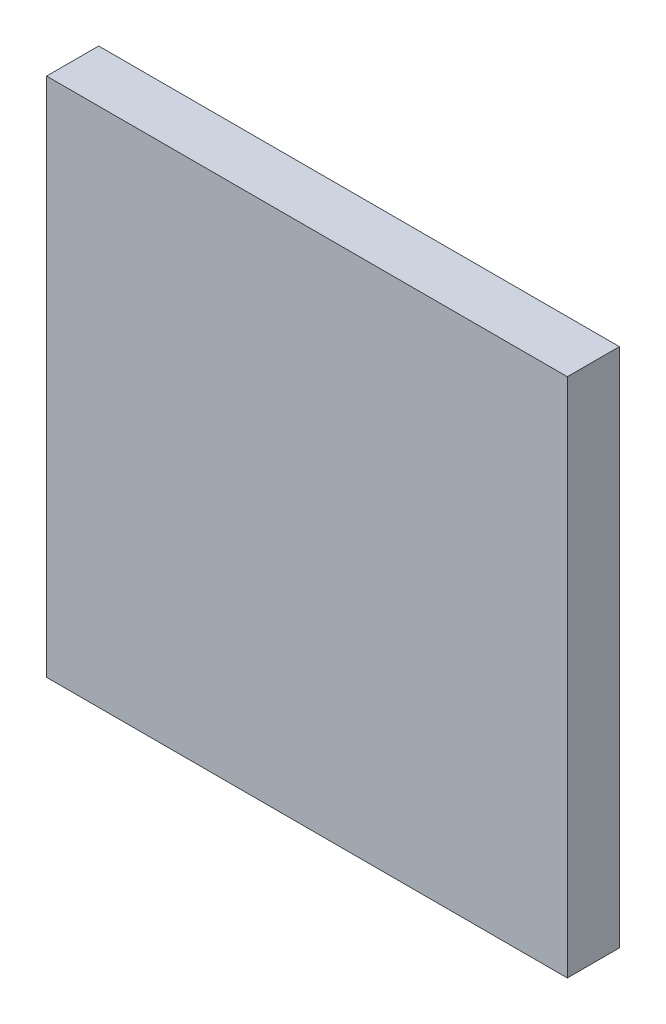
ISO-10303-21;
HEADER;
FILE_DESCRIPTION(('STEP AP214'),'2;1');
FILE_NAME('part.step','',(''),(''),'','','');
FILE_SCHEMA(('AUTOMOTIVE_DESIGN { 1 0 10303 214 1 1 1 1 }'));
ENDSEC;
DATA;
#1=APPLICATION_CONTEXT('core data for automotive mechanical design processes');
#2=APPLICATION_PROTOCOL_DEFINITION('international standard','automotive_design',2000,#1);
#3=PRODUCT_CONTEXT('',#1,'mechanical');
#4=PRODUCT('Part','Part','',(#3));
#5=PRODUCT_RELATED_PRODUCT_CATEGORY('part','',(#4));
#6=PRODUCT_DEFINITION_FORMATION('','',#4);
#7=PRODUCT_DEFINITION_CONTEXT('part definition',#1,'design');
#8=PRODUCT_DEFINITION('design','',#6,#7);
#9=PRODUCT_DEFINITION_SHAPE('','',#8);
#10=(LENGTH_UNIT() NAMED_UNIT(*) SI_UNIT(.MILLI.,.METRE.));
#11=(NAMED_UNIT(*) PLANE_ANGLE_UNIT() SI_UNIT($,.RADIAN.));
#12=(NAMED_UNIT(*) SI_UNIT($,.STERADIAN.) SOLID_ANGLE_UNIT());
#13=UNCERTAINTY_MEASURE_WITH_UNIT(LENGTH_MEASURE(1.E-05),#10,'distance_accuracy_value','');
#14=(GEOMETRIC_REPRESENTATION_CONTEXT(3) GLOBAL_UNCERTAINTY_ASSIGNED_CONTEXT((#13)) GLOBAL_UNIT_ASSIGNED_CONTEXT((#10,
#11,#12)) REPRESENTATION_CONTEXT('',''));
#15=CARTESIAN_POINT('',(0.,0.,0.));
#16=DIRECTION('',(0.,0.,1.));
#17=DIRECTION('',(1.,0.,0.));
#18=AXIS2_PLACEMENT_3D('',#15,#16,#17);
#19=CARTESIAN_POINT('',(0.,0.,100.));
#20=DIRECTION('',(0.,1.,0.));
#21=DIRECTION('',(0.,0.,1.));
#22=AXIS2_PLACEMENT_3D('',#19,#20,#21);
#23=PLANE('',#22);
#24=DIRECTION('',(0.,0.,-1.));
#25=VECTOR('',#24,1.);
#26=CARTESIAN_POINT('',(900.,0.,100.));
#27=LINE('',#26,#25);
#28=CARTESIAN_POINT('',(900.,0.,100.));
#29=VERTEX_POINT('',#28);
#30=CARTESIAN_POINT('',(900.,0.,0.));
#31=VERTEX_POINT('',#30);
#32=EDGE_CURVE('E11',#29,#31,#27,.T.);
#33=ORIENTED_EDGE('',*,*,#32,.F.);
#34=DIRECTION('',(1.,0.,0.));
#35=VECTOR('',#34,1.);
#36=CARTESIAN_POINT('',(0.,0.,100.));
#37=LINE('',#36,#35);
#38=CARTESIAN_POINT('',(350.,0.,100.));
#39=VERTEX_POINT('',#38);
#40=EDGE_CURVE('E146',#39,#29,#37,.T.);
#41=ORIENTED_EDGE('',*,*,#40,.F.);
#42=DIRECTION('',(0.,0.,-1.));
#43=VECTOR('',#42,1.);
#44=CARTESIAN_POINT('',(350.,0.,100.));
#45=LINE('',#44,#43);
#46=CARTESIAN_POINT('',(350.,0.,0.));
#47=VERTEX_POINT('',#46);
#48=EDGE_CURVE('E48',#39,#47,#45,.T.);
#49=ORIENTED_EDGE('',*,*,#48,.T.);
#50=DIRECTION('',(1.,0.,0.));
#51=VECTOR('',#50,1.);
#52=CARTESIAN_POINT('',(0.,0.,0.));
#53=LINE('',#52,#51);
#54=EDGE_CURVE('E144',#47,#31,#53,.T.);
#55=ORIENTED_EDGE('',*,*,#54,.T.);
#56=EDGE_LOOP('',(#33,#41,#49,#55));
#57=FACE_BOUND('',#56,.T.);
#58=ADVANCED_FACE('F39',(#57),#23,.F.);
#59=ORIENTED_EDGE('',*,*,#48,.F.);
#60=CARTESIAN_POINT('',(250.,0.,100.));
#61=VERTEX_POINT('',#60);
#62=EDGE_CURVE('E181',#61,#39,#37,.T.);
#63=ORIENTED_EDGE('',*,*,#62,.F.);
#64=DIRECTION('',(0.,0.,-1.));
#65=VECTOR('',#64,1.);
#66=CARTESIAN_POINT('',(250.,0.,100.));
#67=LINE('',#66,#65);
#68=CARTESIAN_POINT('',(250.,0.,0.));
#69=VERTEX_POINT('',#68);
#70=EDGE_CURVE('E132',#61,#69,#67,.T.);
#71=ORIENTED_EDGE('',*,*,#70,.T.);
#72=EDGE_CURVE('E155',#69,#47,#53,.T.);
#73=ORIENTED_EDGE('',*,*,#72,.T.);
#74=EDGE_LOOP('',(#59,#63,#71,#73));
#75=FACE_BOUND('',#74,.T.);
#76=ADVANCED_FACE('F160',(#75),#23,.F.);
#77=ORIENTED_EDGE('',*,*,#70,.F.);
#78=CARTESIAN_POINT('',(100.,0.,100.));
#79=VERTEX_POINT('',#78);
#80=EDGE_CURVE('E114',#79,#61,#37,.T.);
#81=ORIENTED_EDGE('',*,*,#80,.F.);
#82=DIRECTION('',(0.,0.,-1.));
#83=VECTOR('',#82,1.);
#84=CARTESIAN_POINT('',(100.,0.,100.));
#85=LINE('',#84,#83);
#86=CARTESIAN_POINT('',(100.,0.,0.));
#87=VERTEX_POINT('',#86);
#88=EDGE_CURVE('E109',#79,#87,#85,.T.);
#89=ORIENTED_EDGE('',*,*,#88,.T.);
#90=EDGE_CURVE('E161',#87,#69,#53,.T.);
#91=ORIENTED_EDGE('',*,*,#90,.T.);
#92=EDGE_LOOP('',(#77,#81,#89,#91));
#93=FACE_BOUND('',#92,.T.);
#94=ADVANCED_FACE('F183',(#93),#23,.F.);
#95=ORIENTED_EDGE('',*,*,#88,.F.);
#96=CARTESIAN_POINT('',(0.,0.,100.));
#97=VERTEX_POINT('',#96);
#98=EDGE_CURVE('E102',#97,#79,#37,.T.);
#99=ORIENTED_EDGE('',*,*,#98,.F.);
#100=DIRECTION('',(0.,0.,-1.));
#101=VECTOR('',#100,1.);
#102=CARTESIAN_POINT('',(0.,0.,100.));
#103=LINE('',#102,#101);
#104=CARTESIAN_POINT('',(0.,0.,0.));
#105=VERTEX_POINT('',#104);
#106=EDGE_CURVE('E107',#97,#105,#103,.T.);
#107=ORIENTED_EDGE('',*,*,#106,.T.);
#108=EDGE_CURVE('E162',#105,#87,#53,.T.);
#109=ORIENTED_EDGE('',*,*,#108,.T.);
#110=EDGE_LOOP('',(#95,#99,#107,#109));
#111=FACE_BOUND('',#110,.T.);
#112=ADVANCED_FACE('F104',(#111),#23,.F.);
#113=CARTESIAN_POINT('',(0.,0.,100.));
#114=DIRECTION('',(1.,0.,0.));
#115=DIRECTION('',(0.,0.,-1.));
#116=AXIS2_PLACEMENT_3D('',#113,#114,#115);
#117=PLANE('',#116);
#118=DIRECTION('',(0.,-1.,0.));
#119=VECTOR('',#118,1.);
#120=CARTESIAN_POINT('',(0.,0.,0.));
#121=LINE('',#120,#119);
#122=CARTESIAN_POINT('',(0.,1000.,0.));
#123=VERTEX_POINT('',#122);
#124=EDGE_CURVE('E128',#123,#105,#121,.T.);
#125=ORIENTED_EDGE('',*,*,#124,.T.);
#126=ORIENTED_EDGE('',*,*,#106,.F.);
#127=DIRECTION('',(0.,-1.,0.));
#128=VECTOR('',#127,1.);
#129=CARTESIAN_POINT('',(0.,0.,100.));
#130=LINE('',#129,#128);
#131=CARTESIAN_POINT('',(0.,1000.,100.));
#132=VERTEX_POINT('',#131);
#133=EDGE_CURVE('E118',#132,#97,#130,.T.);
#134=ORIENTED_EDGE('',*,*,#133,.F.);
#135=DIRECTION('',(0.,0.,-1.));
#136=VECTOR('',#135,1.);
#137=CARTESIAN_POINT('',(0.,1000.,100.));
#138=LINE('',#137,#136);
#139=EDGE_CURVE('E169',#132,#123,#138,.T.);
#140=ORIENTED_EDGE('',*,*,#139,.T.);
#141=EDGE_LOOP('',(#125,#126,#134,#140));
#142=FACE_BOUND('',#141,.T.);
#143=ADVANCED_FACE('F41',(#142),#117,.F.);
#144=CARTESIAN_POINT('',(1000.,0.,100.));
#145=VERTEX_POINT('',#144);
#146=EDGE_CURVE('E116',#29,#145,#37,.T.);
#147=ORIENTED_EDGE('',*,*,#146,.F.);
#148=ORIENTED_EDGE('',*,*,#32,.T.);
#149=CARTESIAN_POINT('',(1000.,0.,0.));
#150=VERTEX_POINT('',#149);
#151=EDGE_CURVE('E158',#31,#150,#53,.T.);
#152=ORIENTED_EDGE('',*,*,#151,.T.);
#153=DIRECTION('',(0.,0.,-1.));
#154=VECTOR('',#153,1.);
#155=CARTESIAN_POINT('',(1000.,0.,100.));
#156=LINE('',#155,#154);
#157=EDGE_CURVE('E129',#145,#150,#156,.T.);
#158=ORIENTED_EDGE('',*,*,#157,.F.);
#159=EDGE_LOOP('',(#147,#148,#152,#158));
#160=FACE_BOUND('',#159,.T.);
#161=ADVANCED_FACE('F178',(#160),#23,.F.);
#162=CARTESIAN_POINT('',(1000.,0.,100.));
#163=DIRECTION('',(-1.,0.,0.));
#164=DIRECTION('',(0.,0.,1.));
#165=AXIS2_PLACEMENT_3D('',#162,#163,#164);
#166=PLANE('',#165);
#167=DIRECTION('',(0.,1.,0.));
#168=VECTOR('',#167,1.);
#169=CARTESIAN_POINT('',(1000.,0.,0.));
#170=LINE('',#169,#168);
#171=CARTESIAN_POINT('',(1000.,1000.,0.));
#172=VERTEX_POINT('',#171);
#173=EDGE_CURVE('E165',#150,#172,#170,.T.);
#174=ORIENTED_EDGE('',*,*,#173,.T.);
#175=DIRECTION('',(0.,0.,-1.));
#176=VECTOR('',#175,1.);
#177=CARTESIAN_POINT('',(1000.,1000.,100.));
#178=LINE('',#177,#176);
#179=CARTESIAN_POINT('',(1000.,1000.,100.));
#180=VERTEX_POINT('',#179);
#181=EDGE_CURVE('E135',#180,#172,#178,.T.);
#182=ORIENTED_EDGE('',*,*,#181,.F.);
#183=DIRECTION('',(0.,1.,0.));
#184=VECTOR('',#183,1.);
#185=CARTESIAN_POINT('',(1000.,0.,100.));
#186=LINE('',#185,#184);
#187=EDGE_CURVE('E113',#145,#180,#186,.T.);
#188=ORIENTED_EDGE('',*,*,#187,.F.);
#189=ORIENTED_EDGE('',*,*,#157,.T.);
#190=EDGE_LOOP('',(#174,#182,#188,#189));
#191=FACE_BOUND('',#190,.T.);
#192=ADVANCED_FACE('F179',(#191),#166,.F.);
#193=CARTESIAN_POINT('',(0.,1000.,100.));
#194=DIRECTION('',(0.,-1.,0.));
#195=DIRECTION('',(0.,0.,-1.));
#196=AXIS2_PLACEMENT_3D('',#193,#194,#195);
#197=PLANE('',#196);
#198=DIRECTION('',(-1.,0.,0.));
#199=VECTOR('',#198,1.);
#200=CARTESIAN_POINT('',(0.,1000.,0.));
#201=LINE('',#200,#199);
#202=EDGE_CURVE('E125',#172,#123,#201,.T.);
#203=ORIENTED_EDGE('',*,*,#202,.T.);
#204=ORIENTED_EDGE('',*,*,#139,.F.);
#205=DIRECTION('',(-1.,0.,0.));
#206=VECTOR('',#205,1.);
#207=CARTESIAN_POINT('',(0.,1000.,100.));
#208=LINE('',#207,#206);
#209=EDGE_CURVE('E121',#180,#132,#208,.T.);
#210=ORIENTED_EDGE('',*,*,#209,.F.);
#211=ORIENTED_EDGE('',*,*,#181,.T.);
#212=EDGE_LOOP('',(#203,#204,#210,#211));
#213=FACE_BOUND('',#212,.T.);
#214=ADVANCED_FACE('F174',(#213),#197,.F.);
#215=CARTESIAN_POINT('',(0.,0.,100.));
#216=DIRECTION('',(0.,0.,-1.));
#217=DIRECTION('',(-1.,0.,0.));
#218=AXIS2_PLACEMENT_3D('',#215,#216,#217);
#219=PLANE('',#218);
#220=ORIENTED_EDGE('',*,*,#133,.T.);
#221=ORIENTED_EDGE('',*,*,#98,.T.);
#222=ORIENTED_EDGE('',*,*,#80,.T.);
#223=ORIENTED_EDGE('',*,*,#62,.T.);
#224=ORIENTED_EDGE('',*,*,#40,.T.);
#225=ORIENTED_EDGE('',*,*,#146,.T.);
#226=ORIENTED_EDGE('',*,*,#187,.T.);
#227=ORIENTED_EDGE('',*,*,#209,.T.);
#228=EDGE_LOOP('',(#220,#221,#222,#223,#224,#225,#226,#227));
#229=FACE_BOUND('',#228,.T.);
#230=ADVANCED_FACE('F119',(#229),#219,.F.);
#231=CARTESIAN_POINT('',(0.,0.,0.));
#232=DIRECTION('',(0.,0.,-1.));
#233=DIRECTION('',(-1.,0.,0.));
#234=AXIS2_PLACEMENT_3D('',#231,#232,#233);
#235=PLANE('',#234);
#236=ORIENTED_EDGE('',*,*,#124,.F.);
#237=ORIENTED_EDGE('',*,*,#202,.F.);
#238=ORIENTED_EDGE('',*,*,#173,.F.);
#239=ORIENTED_EDGE('',*,*,#151,.F.);
#240=ORIENTED_EDGE('',*,*,#54,.F.);
#241=ORIENTED_EDGE('',*,*,#72,.F.);
#242=ORIENTED_EDGE('',*,*,#90,.F.);
#243=ORIENTED_EDGE('',*,*,#108,.F.);
#244=EDGE_LOOP('',(#236,#237,#238,#239,#240,#241,#242,#243));
#245=FACE_BOUND('',#244,.T.);
#246=ADVANCED_FACE('F153',(#245),#235,.T.);
#247=CLOSED_SHELL('',(#58,#76,#94,#112,#143,#161,#192,#214,#230,#246));
#248=MANIFOLD_SOLID_BREP('B2',#247);
#249=ADVANCED_BREP_SHAPE_REPRESENTATION('',(#18,#248),#14);
#250=SHAPE_DEFINITION_REPRESENTATION(#9,#249);
ENDSEC;
END-ISO-10303-21;
